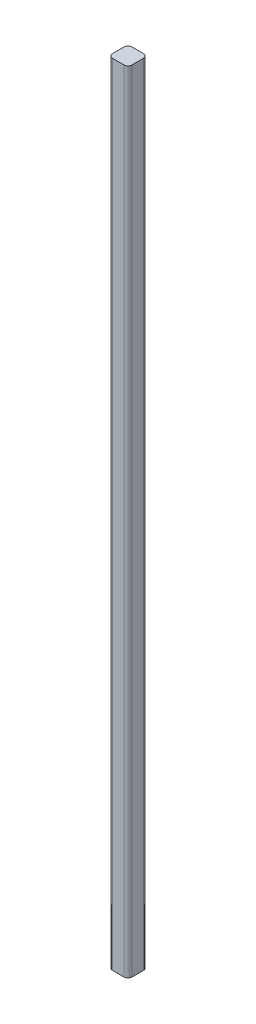
ISO-10303-21;
HEADER;
FILE_DESCRIPTION(('STEP AP214'),'2;1');
FILE_NAME('part.step','',(''),(''),'','','');
FILE_SCHEMA(('AUTOMOTIVE_DESIGN { 1 0 10303 214 1 1 1 1 }'));
ENDSEC;
DATA;
#1=APPLICATION_CONTEXT('core data for automotive mechanical design processes');
#2=APPLICATION_PROTOCOL_DEFINITION('international standard','automotive_design',2000,#1);
#3=PRODUCT_CONTEXT('',#1,'mechanical');
#4=PRODUCT('Part','Part','',(#3));
#5=PRODUCT_RELATED_PRODUCT_CATEGORY('part','',(#4));
#6=PRODUCT_DEFINITION_FORMATION('','',#4);
#7=PRODUCT_DEFINITION_CONTEXT('part definition',#1,'design');
#8=PRODUCT_DEFINITION('design','',#6,#7);
#9=PRODUCT_DEFINITION_SHAPE('','',#8);
#10=(LENGTH_UNIT() NAMED_UNIT(*) SI_UNIT(.MILLI.,.METRE.));
#11=(NAMED_UNIT(*) PLANE_ANGLE_UNIT() SI_UNIT($,.RADIAN.));
#12=(NAMED_UNIT(*) SI_UNIT($,.STERADIAN.) SOLID_ANGLE_UNIT());
#13=UNCERTAINTY_MEASURE_WITH_UNIT(LENGTH_MEASURE(1.E-05),#10,'distance_accuracy_value','');
#14=(GEOMETRIC_REPRESENTATION_CONTEXT(3) GLOBAL_UNCERTAINTY_ASSIGNED_CONTEXT((#13)) GLOBAL_UNIT_ASSIGNED_CONTEXT((#10,
#11,#12)) REPRESENTATION_CONTEXT('',''));
#15=CARTESIAN_POINT('',(0.,0.,0.));
#16=DIRECTION('',(0.,0.,1.));
#17=DIRECTION('',(1.,0.,0.));
#18=AXIS2_PLACEMENT_3D('',#15,#16,#17);
#19=CARTESIAN_POINT('',(3.,405.,-3.));
#20=DIRECTION('',(0.,-1.,0.));
#21=DIRECTION('',(0.,0.,-1.));
#22=AXIS2_PLACEMENT_3D('',#19,#20,#21);
#23=CYLINDRICAL_SURFACE('',#22,2.);
#24=CARTESIAN_POINT('',(3.,0.,-3.));
#25=DIRECTION('',(0.,1.,0.));
#26=DIRECTION('',(0.,0.,-1.));
#27=AXIS2_PLACEMENT_3D('',#24,#25,#26);
#28=CIRCLE('',#27,2.);
#29=CARTESIAN_POINT('',(5.,0.,-3.));
#30=VERTEX_POINT('',#29);
#31=CARTESIAN_POINT('',(3.,0.,-5.));
#32=VERTEX_POINT('',#31);
#33=EDGE_CURVE('E129',#30,#32,#28,.T.);
#34=ORIENTED_EDGE('',*,*,#33,.T.);
#35=DIRECTION('',(0.,-1.,0.));
#36=VECTOR('',#35,1.);
#37=CARTESIAN_POINT('',(3.,405.,-5.));
#38=LINE('',#37,#36);
#39=CARTESIAN_POINT('',(3.,405.,-5.));
#40=VERTEX_POINT('',#39);
#41=EDGE_CURVE('E11',#40,#32,#38,.T.);
#42=ORIENTED_EDGE('',*,*,#41,.F.);
#43=CARTESIAN_POINT('',(3.,405.,-3.));
#44=DIRECTION('',(0.,1.,0.));
#45=DIRECTION('',(0.,0.,-1.));
#46=AXIS2_PLACEMENT_3D('',#43,#44,#45);
#47=CIRCLE('',#46,2.);
#48=CARTESIAN_POINT('',(5.,405.,-3.));
#49=VERTEX_POINT('',#48);
#50=EDGE_CURVE('E143',#49,#40,#47,.T.);
#51=ORIENTED_EDGE('',*,*,#50,.F.);
#52=DIRECTION('',(0.,-1.,0.));
#53=VECTOR('',#52,1.);
#54=CARTESIAN_POINT('',(5.,405.,-3.));
#55=LINE('',#54,#53);
#56=EDGE_CURVE('E125',#49,#30,#55,.T.);
#57=ORIENTED_EDGE('',*,*,#56,.T.);
#58=EDGE_LOOP('',(#34,#42,#51,#57));
#59=FACE_BOUND('',#58,.T.);
#60=ADVANCED_FACE('F33',(#59),#23,.T.);
#61=CARTESIAN_POINT('',(-3.,405.,-5.));
#62=DIRECTION('',(0.,0.,1.));
#63=DIRECTION('',(1.,0.,0.));
#64=AXIS2_PLACEMENT_3D('',#61,#62,#63);
#65=PLANE('',#64);
#66=DIRECTION('',(-1.,0.,0.));
#67=VECTOR('',#66,1.);
#68=CARTESIAN_POINT('',(-3.,0.,-5.));
#69=LINE('',#68,#67);
#70=CARTESIAN_POINT('',(-3.,0.,-5.));
#71=VERTEX_POINT('',#70);
#72=EDGE_CURVE('E132',#32,#71,#69,.T.);
#73=ORIENTED_EDGE('',*,*,#72,.T.);
#74=DIRECTION('',(0.,-1.,0.));
#75=VECTOR('',#74,1.);
#76=CARTESIAN_POINT('',(-3.,405.,-5.));
#77=LINE('',#76,#75);
#78=CARTESIAN_POINT('',(-3.,405.,-5.));
#79=VERTEX_POINT('',#78);
#80=EDGE_CURVE('E41',#79,#71,#77,.T.);
#81=ORIENTED_EDGE('',*,*,#80,.F.);
#82=DIRECTION('',(-1.,0.,0.));
#83=VECTOR('',#82,1.);
#84=CARTESIAN_POINT('',(-3.,405.,-5.));
#85=LINE('',#84,#83);
#86=EDGE_CURVE('E92',#40,#79,#85,.T.);
#87=ORIENTED_EDGE('',*,*,#86,.F.);
#88=ORIENTED_EDGE('',*,*,#41,.T.);
#89=EDGE_LOOP('',(#73,#81,#87,#88));
#90=FACE_BOUND('',#89,.T.);
#91=ADVANCED_FACE('F178',(#90),#65,.F.);
#92=CARTESIAN_POINT('',(-3.,405.,-3.));
#93=DIRECTION('',(0.,-1.,0.));
#94=DIRECTION('',(0.,0.,-1.));
#95=AXIS2_PLACEMENT_3D('',#92,#93,#94);
#96=CYLINDRICAL_SURFACE('',#95,2.);
#97=CARTESIAN_POINT('',(-3.,0.,-3.));
#98=DIRECTION('',(0.,1.,0.));
#99=DIRECTION('',(0.,0.,-1.));
#100=AXIS2_PLACEMENT_3D('',#97,#98,#99);
#101=CIRCLE('',#100,2.);
#102=CARTESIAN_POINT('',(-5.,0.,-3.));
#103=VERTEX_POINT('',#102);
#104=EDGE_CURVE('E134',#71,#103,#101,.T.);
#105=ORIENTED_EDGE('',*,*,#104,.T.);
#106=DIRECTION('',(0.,-1.,0.));
#107=VECTOR('',#106,1.);
#108=CARTESIAN_POINT('',(-5.,405.,-3.));
#109=LINE('',#108,#107);
#110=CARTESIAN_POINT('',(-5.,405.,-3.));
#111=VERTEX_POINT('',#110);
#112=EDGE_CURVE('E150',#111,#103,#109,.T.);
#113=ORIENTED_EDGE('',*,*,#112,.F.);
#114=CARTESIAN_POINT('',(-3.,405.,-3.));
#115=DIRECTION('',(0.,1.,0.));
#116=DIRECTION('',(0.,0.,-1.));
#117=AXIS2_PLACEMENT_3D('',#114,#115,#116);
#118=CIRCLE('',#117,2.);
#119=EDGE_CURVE('E158',#79,#111,#118,.T.);
#120=ORIENTED_EDGE('',*,*,#119,.F.);
#121=ORIENTED_EDGE('',*,*,#80,.T.);
#122=EDGE_LOOP('',(#105,#113,#120,#121));
#123=FACE_BOUND('',#122,.T.);
#124=ADVANCED_FACE('F156',(#123),#96,.T.);
#125=CARTESIAN_POINT('',(-5.,405.,3.));
#126=DIRECTION('',(1.,0.,0.));
#127=DIRECTION('',(0.,0.,-1.));
#128=AXIS2_PLACEMENT_3D('',#125,#126,#127);
#129=PLANE('',#128);
#130=DIRECTION('',(0.,0.,1.));
#131=VECTOR('',#130,1.);
#132=CARTESIAN_POINT('',(-5.,0.,3.));
#133=LINE('',#132,#131);
#134=CARTESIAN_POINT('',(-5.,0.,3.));
#135=VERTEX_POINT('',#134);
#136=EDGE_CURVE('E136',#103,#135,#133,.T.);
#137=ORIENTED_EDGE('',*,*,#136,.T.);
#138=DIRECTION('',(0.,-1.,0.));
#139=VECTOR('',#138,1.);
#140=CARTESIAN_POINT('',(-5.,405.,3.));
#141=LINE('',#140,#139);
#142=CARTESIAN_POINT('',(-5.,405.,3.));
#143=VERTEX_POINT('',#142);
#144=EDGE_CURVE('E147',#143,#135,#141,.T.);
#145=ORIENTED_EDGE('',*,*,#144,.F.);
#146=DIRECTION('',(0.,0.,1.));
#147=VECTOR('',#146,1.);
#148=CARTESIAN_POINT('',(-5.,405.,3.));
#149=LINE('',#148,#147);
#150=EDGE_CURVE('E170',#111,#143,#149,.T.);
#151=ORIENTED_EDGE('',*,*,#150,.F.);
#152=ORIENTED_EDGE('',*,*,#112,.T.);
#153=EDGE_LOOP('',(#137,#145,#151,#152));
#154=FACE_BOUND('',#153,.T.);
#155=ADVANCED_FACE('F166',(#154),#129,.F.);
#156=CARTESIAN_POINT('',(-3.,405.,3.));
#157=DIRECTION('',(0.,-1.,0.));
#158=DIRECTION('',(0.,0.,-1.));
#159=AXIS2_PLACEMENT_3D('',#156,#157,#158);
#160=CYLINDRICAL_SURFACE('',#159,2.);
#161=CARTESIAN_POINT('',(-3.,0.,3.));
#162=DIRECTION('',(0.,1.,0.));
#163=DIRECTION('',(0.,0.,-1.));
#164=AXIS2_PLACEMENT_3D('',#161,#162,#163);
#165=CIRCLE('',#164,2.);
#166=CARTESIAN_POINT('',(-3.,0.,5.));
#167=VERTEX_POINT('',#166);
#168=EDGE_CURVE('E138',#135,#167,#165,.T.);
#169=ORIENTED_EDGE('',*,*,#168,.T.);
#170=DIRECTION('',(0.,-1.,0.));
#171=VECTOR('',#170,1.);
#172=CARTESIAN_POINT('',(-3.,405.,5.));
#173=LINE('',#172,#171);
#174=CARTESIAN_POINT('',(-3.,405.,5.));
#175=VERTEX_POINT('',#174);
#176=EDGE_CURVE('E120',#175,#167,#173,.T.);
#177=ORIENTED_EDGE('',*,*,#176,.F.);
#178=CARTESIAN_POINT('',(-3.,405.,3.));
#179=DIRECTION('',(0.,1.,0.));
#180=DIRECTION('',(0.,0.,-1.));
#181=AXIS2_PLACEMENT_3D('',#178,#179,#180);
#182=CIRCLE('',#181,2.);
#183=EDGE_CURVE('E111',#143,#175,#182,.T.);
#184=ORIENTED_EDGE('',*,*,#183,.F.);
#185=ORIENTED_EDGE('',*,*,#144,.T.);
#186=EDGE_LOOP('',(#169,#177,#184,#185));
#187=FACE_BOUND('',#186,.T.);
#188=ADVANCED_FACE('F169',(#187),#160,.T.);
#189=CARTESIAN_POINT('',(-3.,405.,5.));
#190=DIRECTION('',(0.,0.,-1.));
#191=DIRECTION('',(-1.,0.,0.));
#192=AXIS2_PLACEMENT_3D('',#189,#190,#191);
#193=PLANE('',#192);
#194=DIRECTION('',(1.,0.,0.));
#195=VECTOR('',#194,1.);
#196=CARTESIAN_POINT('',(-3.,0.,5.));
#197=LINE('',#196,#195);
#198=CARTESIAN_POINT('',(3.,0.,5.));
#199=VERTEX_POINT('',#198);
#200=EDGE_CURVE('E119',#167,#199,#197,.T.);
#201=ORIENTED_EDGE('',*,*,#200,.T.);
#202=DIRECTION('',(0.,-1.,0.));
#203=VECTOR('',#202,1.);
#204=CARTESIAN_POINT('',(3.,405.,5.));
#205=LINE('',#204,#203);
#206=CARTESIAN_POINT('',(3.,405.,5.));
#207=VERTEX_POINT('',#206);
#208=EDGE_CURVE('E116',#207,#199,#205,.T.);
#209=ORIENTED_EDGE('',*,*,#208,.F.);
#210=DIRECTION('',(1.,0.,0.));
#211=VECTOR('',#210,1.);
#212=CARTESIAN_POINT('',(-3.,405.,5.));
#213=LINE('',#212,#211);
#214=EDGE_CURVE('E105',#175,#207,#213,.T.);
#215=ORIENTED_EDGE('',*,*,#214,.F.);
#216=ORIENTED_EDGE('',*,*,#176,.T.);
#217=EDGE_LOOP('',(#201,#209,#215,#216));
#218=FACE_BOUND('',#217,.T.);
#219=ADVANCED_FACE('F117',(#218),#193,.F.);
#220=CARTESIAN_POINT('',(3.,405.,3.));
#221=DIRECTION('',(0.,-1.,0.));
#222=DIRECTION('',(0.,0.,-1.));
#223=AXIS2_PLACEMENT_3D('',#220,#221,#222);
#224=CYLINDRICAL_SURFACE('',#223,2.);
#225=CARTESIAN_POINT('',(3.,0.,3.));
#226=DIRECTION('',(0.,1.,0.));
#227=DIRECTION('',(0.,0.,-1.));
#228=AXIS2_PLACEMENT_3D('',#225,#226,#227);
#229=CIRCLE('',#228,2.);
#230=CARTESIAN_POINT('',(5.,0.,3.));
#231=VERTEX_POINT('',#230);
#232=EDGE_CURVE('E78',#199,#231,#229,.T.);
#233=ORIENTED_EDGE('',*,*,#232,.T.);
#234=DIRECTION('',(0.,-1.,0.));
#235=VECTOR('',#234,1.);
#236=CARTESIAN_POINT('',(5.,405.,3.));
#237=LINE('',#236,#235);
#238=CARTESIAN_POINT('',(5.,405.,3.));
#239=VERTEX_POINT('',#238);
#240=EDGE_CURVE('E121',#239,#231,#237,.T.);
#241=ORIENTED_EDGE('',*,*,#240,.F.);
#242=CARTESIAN_POINT('',(3.,405.,3.));
#243=DIRECTION('',(0.,1.,0.));
#244=DIRECTION('',(0.,0.,-1.));
#245=AXIS2_PLACEMENT_3D('',#242,#243,#244);
#246=CIRCLE('',#245,2.);
#247=EDGE_CURVE('E109',#207,#239,#246,.T.);
#248=ORIENTED_EDGE('',*,*,#247,.F.);
#249=ORIENTED_EDGE('',*,*,#208,.T.);
#250=EDGE_LOOP('',(#233,#241,#248,#249));
#251=FACE_BOUND('',#250,.T.);
#252=ADVANCED_FACE('F123',(#251),#224,.T.);
#253=CARTESIAN_POINT('',(5.,405.,3.));
#254=DIRECTION('',(-1.,0.,0.));
#255=DIRECTION('',(0.,0.,1.));
#256=AXIS2_PLACEMENT_3D('',#253,#254,#255);
#257=PLANE('',#256);
#258=DIRECTION('',(0.,0.,-1.));
#259=VECTOR('',#258,1.);
#260=CARTESIAN_POINT('',(5.,0.,3.));
#261=LINE('',#260,#259);
#262=EDGE_CURVE('E84',#231,#30,#261,.T.);
#263=ORIENTED_EDGE('',*,*,#262,.T.);
#264=ORIENTED_EDGE('',*,*,#56,.F.);
#265=DIRECTION('',(0.,0.,-1.));
#266=VECTOR('',#265,1.);
#267=CARTESIAN_POINT('',(5.,405.,3.));
#268=LINE('',#267,#266);
#269=EDGE_CURVE('E49',#239,#49,#268,.T.);
#270=ORIENTED_EDGE('',*,*,#269,.F.);
#271=ORIENTED_EDGE('',*,*,#240,.T.);
#272=EDGE_LOOP('',(#263,#264,#270,#271));
#273=FACE_BOUND('',#272,.T.);
#274=ADVANCED_FACE('F194',(#273),#257,.F.);
#275=CARTESIAN_POINT('',(3.,405.,-3.));
#276=DIRECTION('',(0.,-1.,0.));
#277=DIRECTION('',(0.,0.,-1.));
#278=AXIS2_PLACEMENT_3D('',#275,#276,#277);
#279=PLANE('',#278);
#280=ORIENTED_EDGE('',*,*,#50,.T.);
#281=ORIENTED_EDGE('',*,*,#86,.T.);
#282=ORIENTED_EDGE('',*,*,#119,.T.);
#283=ORIENTED_EDGE('',*,*,#150,.T.);
#284=ORIENTED_EDGE('',*,*,#183,.T.);
#285=ORIENTED_EDGE('',*,*,#214,.T.);
#286=ORIENTED_EDGE('',*,*,#247,.T.);
#287=ORIENTED_EDGE('',*,*,#269,.T.);
#288=EDGE_LOOP('',(#280,#281,#282,#283,#284,#285,#286,#287));
#289=FACE_BOUND('',#288,.T.);
#290=ADVANCED_FACE('F107',(#289),#279,.F.);
#291=CARTESIAN_POINT('',(3.,0.,-3.));
#292=DIRECTION('',(0.,-1.,0.));
#293=DIRECTION('',(0.,0.,-1.));
#294=AXIS2_PLACEMENT_3D('',#291,#292,#293);
#295=PLANE('',#294);
#296=ORIENTED_EDGE('',*,*,#33,.F.);
#297=ORIENTED_EDGE('',*,*,#262,.F.);
#298=ORIENTED_EDGE('',*,*,#232,.F.);
#299=ORIENTED_EDGE('',*,*,#200,.F.);
#300=ORIENTED_EDGE('',*,*,#168,.F.);
#301=ORIENTED_EDGE('',*,*,#136,.F.);
#302=ORIENTED_EDGE('',*,*,#104,.F.);
#303=ORIENTED_EDGE('',*,*,#72,.F.);
#304=EDGE_LOOP('',(#296,#297,#298,#299,#300,#301,#302,#303));
#305=FACE_BOUND('',#304,.T.);
#306=ADVANCED_FACE('F162',(#305),#295,.T.);
#307=CLOSED_SHELL('',(#60,#91,#124,#155,#188,#219,#252,#274,#290,#306));
#308=MANIFOLD_SOLID_BREP('B2',#307);
#309=ADVANCED_BREP_SHAPE_REPRESENTATION('',(#18,#308),#14);
#310=SHAPE_DEFINITION_REPRESENTATION(#9,#309);
ENDSEC;
END-ISO-10303-21;
